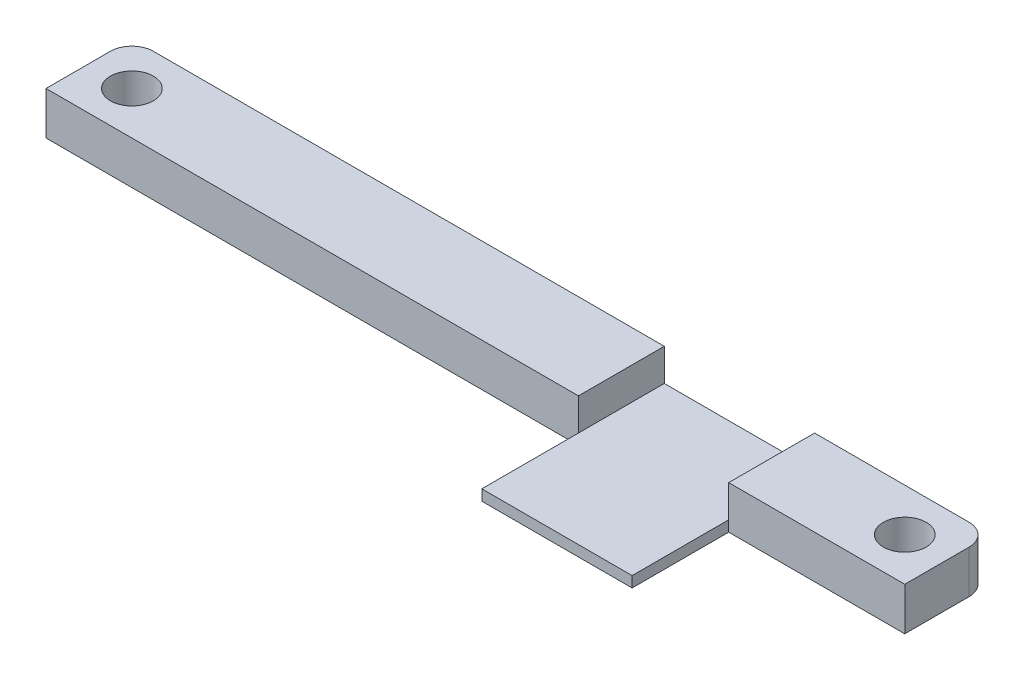
ISO-10303-21;
HEADER;
FILE_DESCRIPTION(('STEP AP214'),'2;1');
FILE_NAME('part.step','',(''),(''),'','','');
FILE_SCHEMA(('AUTOMOTIVE_DESIGN { 1 0 10303 214 1 1 1 1 }'));
ENDSEC;
DATA;
#1=APPLICATION_CONTEXT('core data for automotive mechanical design processes');
#2=APPLICATION_PROTOCOL_DEFINITION('international standard','automotive_design',2000,#1);
#3=PRODUCT_CONTEXT('',#1,'mechanical');
#4=PRODUCT('Part','Part','',(#3));
#5=PRODUCT_RELATED_PRODUCT_CATEGORY('part','',(#4));
#6=PRODUCT_DEFINITION_FORMATION('','',#4);
#7=PRODUCT_DEFINITION_CONTEXT('part definition',#1,'design');
#8=PRODUCT_DEFINITION('design','',#6,#7);
#9=PRODUCT_DEFINITION_SHAPE('','',#8);
#10=(LENGTH_UNIT() NAMED_UNIT(*) SI_UNIT(.MILLI.,.METRE.));
#11=(NAMED_UNIT(*) PLANE_ANGLE_UNIT() SI_UNIT($,.RADIAN.));
#12=(NAMED_UNIT(*) SI_UNIT($,.STERADIAN.) SOLID_ANGLE_UNIT());
#13=UNCERTAINTY_MEASURE_WITH_UNIT(LENGTH_MEASURE(1.E-05),#10,'distance_accuracy_value','');
#14=(GEOMETRIC_REPRESENTATION_CONTEXT(3) GLOBAL_UNCERTAINTY_ASSIGNED_CONTEXT((#13)) GLOBAL_UNIT_ASSIGNED_CONTEXT((#10,
#11,#12)) REPRESENTATION_CONTEXT('',''));
#15=CARTESIAN_POINT('',(0.,0.,0.));
#16=DIRECTION('',(0.,0.,1.));
#17=DIRECTION('',(1.,0.,0.));
#18=AXIS2_PLACEMENT_3D('',#15,#16,#17);
#19=CARTESIAN_POINT('',(0.,-8.,2.));
#20=DIRECTION('',(0.,0.,1.));
#21=DIRECTION('',(1.,0.,0.));
#22=AXIS2_PLACEMENT_3D('',#19,#20,#21);
#23=PLANE('',#22);
#24=DIRECTION('',(-1.,0.,0.));
#25=VECTOR('',#24,1.);
#26=CARTESIAN_POINT('',(0.,8.,2.00000000000001));
#27=LINE('',#26,#25);
#28=CARTESIAN_POINT('',(9.60000000000001,8.,2.));
#29=VERTEX_POINT('',#28);
#30=CARTESIAN_POINT('',(-40.,8.,2.));
#31=VERTEX_POINT('',#30);
#32=EDGE_CURVE('E324',#29,#31,#27,.T.);
#33=ORIENTED_EDGE('',*,*,#32,.F.);
#34=DIRECTION('',(0.,1.,0.));
#35=VECTOR('',#34,1.);
#36=CARTESIAN_POINT('',(9.60000000000001,8.,2.));
#37=LINE('',#36,#35);
#38=CARTESIAN_POINT('',(9.60000000000001,9.,2.));
#39=VERTEX_POINT('',#38);
#40=EDGE_CURVE('E228',#29,#39,#37,.T.);
#41=ORIENTED_EDGE('',*,*,#40,.T.);
#42=DIRECTION('',(0.,1.,0.));
#43=VECTOR('',#42,1.);
#44=CARTESIAN_POINT('',(9.60000000000001,10.,2.));
#45=LINE('',#44,#43);
#46=CARTESIAN_POINT('',(9.60000000000001,12.,2.));
#47=VERTEX_POINT('',#46);
#48=EDGE_CURVE('E245',#39,#47,#45,.T.);
#49=ORIENTED_EDGE('',*,*,#48,.T.);
#50=DIRECTION('',(1.,0.,0.));
#51=VECTOR('',#50,1.);
#52=CARTESIAN_POINT('',(0.,12.,2.));
#53=LINE('',#52,#51);
#54=CARTESIAN_POINT('',(-40.,12.,2.));
#55=VERTEX_POINT('',#54);
#56=EDGE_CURVE('E319',#55,#47,#53,.T.);
#57=ORIENTED_EDGE('',*,*,#56,.F.);
#58=DIRECTION('',(0.,1.,0.));
#59=VECTOR('',#58,1.);
#60=CARTESIAN_POINT('',(-40.,8.,2.));
#61=LINE('',#60,#59);
#62=EDGE_CURVE('E310',#31,#55,#61,.T.);
#63=ORIENTED_EDGE('',*,*,#62,.F.);
#64=EDGE_LOOP('',(#33,#41,#49,#57,#63));
#65=FACE_BOUND('',#64,.T.);
#66=ADVANCED_FACE('F76',(#65),#23,.T.);
#67=CARTESIAN_POINT('',(0.,12.,0.));
#68=DIRECTION('',(0.,1.,0.));
#69=DIRECTION('',(0.,0.,1.));
#70=AXIS2_PLACEMENT_3D('',#67,#68,#69);
#71=PLANE('',#70);
#72=CARTESIAN_POINT('',(-36.,12.,-2.));
#73=DIRECTION('',(0.,1.,0.));
#74=DIRECTION('',(0.,0.,1.));
#75=AXIS2_PLACEMENT_3D('',#72,#73,#74);
#76=CIRCLE('',#75,2.);
#77=CARTESIAN_POINT('',(-36.,12.,0.));
#78=VERTEX_POINT('',#77);
#79=EDGE_CURVE('E282',#78,#78,#76,.T.);
#80=ORIENTED_EDGE('',*,*,#79,.F.);
#81=EDGE_LOOP('',(#80));
#82=FACE_BOUND('',#81,.T.);
#83=ORIENTED_EDGE('',*,*,#56,.T.);
#84=DIRECTION('',(0.,0.,-1.));
#85=VECTOR('',#84,1.);
#86=CARTESIAN_POINT('',(9.60000000000001,12.,2.));
#87=LINE('',#86,#85);
#88=CARTESIAN_POINT('',(9.60000000000001,12.,-6.00000000000003));
#89=VERTEX_POINT('',#88);
#90=EDGE_CURVE('E240',#47,#89,#87,.T.);
#91=ORIENTED_EDGE('',*,*,#90,.T.);
#92=DIRECTION('',(-1.,0.,0.));
#93=VECTOR('',#92,1.);
#94=CARTESIAN_POINT('',(-36.,12.,-6.));
#95=LINE('',#94,#93);
#96=CARTESIAN_POINT('',(-38.,12.,-6.));
#97=VERTEX_POINT('',#96);
#98=EDGE_CURVE('E119',#89,#97,#95,.T.);
#99=ORIENTED_EDGE('',*,*,#98,.T.);
#100=CARTESIAN_POINT('',(-38.,12.,-4.));
#101=DIRECTION('',(0.,1.,0.));
#102=DIRECTION('',(0.,0.,1.));
#103=AXIS2_PLACEMENT_3D('',#100,#101,#102);
#104=CIRCLE('',#103,2.);
#105=CARTESIAN_POINT('',(-40.,12.,-4.));
#106=VERTEX_POINT('',#105);
#107=EDGE_CURVE('E300',#106,#97,#104,.F.);
#108=ORIENTED_EDGE('',*,*,#107,.F.);
#109=DIRECTION('',(0.,0.,-1.));
#110=VECTOR('',#109,1.);
#111=CARTESIAN_POINT('',(-40.,12.,0.));
#112=LINE('',#111,#110);
#113=EDGE_CURVE('E291',#55,#106,#112,.T.);
#114=ORIENTED_EDGE('',*,*,#113,.F.);
#115=EDGE_LOOP('',(#83,#91,#99,#108,#114));
#116=FACE_BOUND('',#115,.T.);
#117=ADVANCED_FACE('F377',(#82,#116),#71,.T.);
#118=DIRECTION('',(0.,0.,-1.));
#119=VECTOR('',#118,1.);
#120=CARTESIAN_POINT('',(23.6,12.,2.));
#121=LINE('',#120,#119);
#122=CARTESIAN_POINT('',(23.6,12.,2.));
#123=VERTEX_POINT('',#122);
#124=CARTESIAN_POINT('',(23.6,12.,-6.00000000000003));
#125=VERTEX_POINT('',#124);
#126=EDGE_CURVE('E187',#123,#125,#121,.T.);
#127=ORIENTED_EDGE('',*,*,#126,.F.);
#128=CARTESIAN_POINT('',(40.,12.,2.));
#129=VERTEX_POINT('',#128);
#130=EDGE_CURVE('E309',#123,#129,#53,.T.);
#131=ORIENTED_EDGE('',*,*,#130,.T.);
#132=DIRECTION('',(0.,0.,1.));
#133=VECTOR('',#132,1.);
#134=CARTESIAN_POINT('',(40.,12.,-4.));
#135=LINE('',#134,#133);
#136=CARTESIAN_POINT('',(40.,12.,-4.));
#137=VERTEX_POINT('',#136);
#138=EDGE_CURVE('E262',#137,#129,#135,.T.);
#139=ORIENTED_EDGE('',*,*,#138,.F.);
#140=CARTESIAN_POINT('',(38.,12.,-4.));
#141=DIRECTION('',(0.,1.,0.));
#142=DIRECTION('',(0.,0.,1.));
#143=AXIS2_PLACEMENT_3D('',#140,#141,#142);
#144=CIRCLE('',#143,2.);
#145=CARTESIAN_POINT('',(38.,12.,-6.));
#146=VERTEX_POINT('',#145);
#147=EDGE_CURVE('E266',#137,#146,#144,.T.);
#148=ORIENTED_EDGE('',*,*,#147,.T.);
#149=EDGE_CURVE('E85',#146,#125,#95,.T.);
#150=ORIENTED_EDGE('',*,*,#149,.T.);
#151=EDGE_LOOP('',(#127,#131,#139,#148,#150));
#152=FACE_BOUND('',#151,.T.);
#153=CARTESIAN_POINT('',(36.,12.,-2.));
#154=DIRECTION('',(0.,1.,0.));
#155=DIRECTION('',(0.,0.,1.));
#156=AXIS2_PLACEMENT_3D('',#153,#154,#155);
#157=CIRCLE('',#156,2.);
#158=CARTESIAN_POINT('',(36.,12.,0.));
#159=VERTEX_POINT('',#158);
#160=EDGE_CURVE('E278',#159,#159,#157,.T.);
#161=ORIENTED_EDGE('',*,*,#160,.F.);
#162=EDGE_LOOP('',(#161));
#163=FACE_BOUND('',#162,.T.);
#164=ADVANCED_FACE('F358',(#152,#163),#71,.T.);
#165=CARTESIAN_POINT('',(0.,8.,-6.));
#166=DIRECTION('',(0.,-1.,0.));
#167=DIRECTION('',(0.,0.,-1.));
#168=AXIS2_PLACEMENT_3D('',#165,#166,#167);
#169=PLANE('',#168);
#170=DIRECTION('',(1.,0.,0.));
#171=VECTOR('',#170,1.);
#172=CARTESIAN_POINT('',(0.,8.,-6.));
#173=LINE('',#172,#171);
#174=CARTESIAN_POINT('',(-38.,8.,-6.));
#175=VERTEX_POINT('',#174);
#176=CARTESIAN_POINT('',(38.,8.,-6.));
#177=VERTEX_POINT('',#176);
#178=EDGE_CURVE('E100',#175,#177,#173,.T.);
#179=ORIENTED_EDGE('',*,*,#178,.T.);
#180=CARTESIAN_POINT('',(38.,8.,-4.));
#181=DIRECTION('',(0.,1.,0.));
#182=DIRECTION('',(0.,0.,1.));
#183=AXIS2_PLACEMENT_3D('',#180,#181,#182);
#184=CIRCLE('',#183,2.);
#185=CARTESIAN_POINT('',(40.,8.,-4.));
#186=VERTEX_POINT('',#185);
#187=EDGE_CURVE('E267',#186,#177,#184,.T.);
#188=ORIENTED_EDGE('',*,*,#187,.F.);
#189=DIRECTION('',(0.,0.,1.));
#190=VECTOR('',#189,1.);
#191=CARTESIAN_POINT('',(40.,8.,-4.));
#192=LINE('',#191,#190);
#193=CARTESIAN_POINT('',(40.,8.,2.));
#194=VERTEX_POINT('',#193);
#195=EDGE_CURVE('E261',#186,#194,#192,.T.);
#196=ORIENTED_EDGE('',*,*,#195,.T.);
#197=CARTESIAN_POINT('',(23.6,8.,2.));
#198=VERTEX_POINT('',#197);
#199=EDGE_CURVE('E320',#194,#198,#27,.T.);
#200=ORIENTED_EDGE('',*,*,#199,.T.);
#201=DIRECTION('',(0.,0.,1.));
#202=VECTOR('',#201,1.);
#203=CARTESIAN_POINT('',(23.6,8.,2.));
#204=LINE('',#203,#202);
#205=CARTESIAN_POINT('',(23.6,8.,11.));
#206=VERTEX_POINT('',#205);
#207=EDGE_CURVE('E216',#198,#206,#204,.T.);
#208=ORIENTED_EDGE('',*,*,#207,.T.);
#209=DIRECTION('',(1.,0.,0.));
#210=VECTOR('',#209,1.);
#211=CARTESIAN_POINT('',(9.60000000000001,8.,11.));
#212=LINE('',#211,#210);
#213=CARTESIAN_POINT('',(9.60000000000001,8.,11.));
#214=VERTEX_POINT('',#213);
#215=EDGE_CURVE('E212',#214,#206,#212,.T.);
#216=ORIENTED_EDGE('',*,*,#215,.F.);
#217=DIRECTION('',(0.,0.,1.));
#218=VECTOR('',#217,1.);
#219=CARTESIAN_POINT('',(9.60000000000001,8.,2.));
#220=LINE('',#219,#218);
#221=EDGE_CURVE('E219',#29,#214,#220,.T.);
#222=ORIENTED_EDGE('',*,*,#221,.F.);
#223=ORIENTED_EDGE('',*,*,#32,.T.);
#224=DIRECTION('',(0.,0.,-1.));
#225=VECTOR('',#224,1.);
#226=CARTESIAN_POINT('',(-40.,8.,0.));
#227=LINE('',#226,#225);
#228=CARTESIAN_POINT('',(-40.,8.,-4.));
#229=VERTEX_POINT('',#228);
#230=EDGE_CURVE('E123',#31,#229,#227,.T.);
#231=ORIENTED_EDGE('',*,*,#230,.T.);
#232=CARTESIAN_POINT('',(-38.,8.,-4.));
#233=DIRECTION('',(0.,1.,0.));
#234=DIRECTION('',(0.,0.,1.));
#235=AXIS2_PLACEMENT_3D('',#232,#233,#234);
#236=CIRCLE('',#235,2.);
#237=EDGE_CURVE('E290',#229,#175,#236,.F.);
#238=ORIENTED_EDGE('',*,*,#237,.T.);
#239=EDGE_LOOP('',(#179,#188,#196,#200,#208,#216,#222,#223,#231,#238));
#240=FACE_BOUND('',#239,.T.);
#241=CARTESIAN_POINT('',(-36.,8.,-2.));
#242=DIRECTION('',(0.,1.,0.));
#243=DIRECTION('',(0.,0.,1.));
#244=AXIS2_PLACEMENT_3D('',#241,#242,#243);
#245=CIRCLE('',#244,2.);
#246=CARTESIAN_POINT('',(-36.,8.,0.));
#247=VERTEX_POINT('',#246);
#248=EDGE_CURVE('E286',#247,#247,#245,.T.);
#249=ORIENTED_EDGE('',*,*,#248,.T.);
#250=EDGE_LOOP('',(#249));
#251=FACE_BOUND('',#250,.T.);
#252=CARTESIAN_POINT('',(36.,8.,-2.));
#253=DIRECTION('',(0.,1.,0.));
#254=DIRECTION('',(0.,0.,1.));
#255=AXIS2_PLACEMENT_3D('',#252,#253,#254);
#256=CIRCLE('',#255,2.);
#257=CARTESIAN_POINT('',(36.,8.,0.));
#258=VERTEX_POINT('',#257);
#259=EDGE_CURVE('E271',#258,#258,#256,.T.);
#260=ORIENTED_EDGE('',*,*,#259,.T.);
#261=EDGE_LOOP('',(#260));
#262=FACE_BOUND('',#261,.T.);
#263=ADVANCED_FACE('F340',(#240,#251,#262),#169,.T.);
#264=CARTESIAN_POINT('',(-36.,12.,-6.));
#265=DIRECTION('',(0.,0.,-1.));
#266=DIRECTION('',(-1.,0.,0.));
#267=AXIS2_PLACEMENT_3D('',#264,#265,#266);
#268=PLANE('',#267);
#269=DIRECTION('',(-1.,0.,0.));
#270=VECTOR('',#269,1.);
#271=CARTESIAN_POINT('',(23.6,9.,-6.));
#272=LINE('',#271,#270);
#273=CARTESIAN_POINT('',(23.6,9.,-6.));
#274=VERTEX_POINT('',#273);
#275=CARTESIAN_POINT('',(9.60000000000001,9.,-6.));
#276=VERTEX_POINT('',#275);
#277=EDGE_CURVE('E197',#274,#276,#272,.T.);
#278=ORIENTED_EDGE('',*,*,#277,.F.);
#279=DIRECTION('',(0.,1.,0.));
#280=VECTOR('',#279,1.);
#281=CARTESIAN_POINT('',(23.6,10.,-6.00000000000003));
#282=LINE('',#281,#280);
#283=EDGE_CURVE('E182',#274,#125,#282,.T.);
#284=ORIENTED_EDGE('',*,*,#283,.T.);
#285=ORIENTED_EDGE('',*,*,#149,.F.);
#286=DIRECTION('',(0.,1.,0.));
#287=VECTOR('',#286,1.);
#288=CARTESIAN_POINT('',(38.,8.,-6.));
#289=LINE('',#288,#287);
#290=EDGE_CURVE('E191',#177,#146,#289,.T.);
#291=ORIENTED_EDGE('',*,*,#290,.F.);
#292=ORIENTED_EDGE('',*,*,#178,.F.);
#293=DIRECTION('',(0.,1.,0.));
#294=VECTOR('',#293,1.);
#295=CARTESIAN_POINT('',(-38.,8.,-6.));
#296=LINE('',#295,#294);
#297=EDGE_CURVE('E306',#175,#97,#296,.T.);
#298=ORIENTED_EDGE('',*,*,#297,.T.);
#299=ORIENTED_EDGE('',*,*,#98,.F.);
#300=DIRECTION('',(0.,1.,0.));
#301=VECTOR('',#300,1.);
#302=CARTESIAN_POINT('',(9.60000000000001,10.,-6.00000000000003));
#303=LINE('',#302,#301);
#304=EDGE_CURVE('E202',#276,#89,#303,.T.);
#305=ORIENTED_EDGE('',*,*,#304,.F.);
#306=EDGE_LOOP('',(#278,#284,#285,#291,#292,#298,#299,#305));
#307=FACE_BOUND('',#306,.T.);
#308=ADVANCED_FACE('F78',(#307),#268,.T.);
#309=DIRECTION('',(0.,1.,0.));
#310=VECTOR('',#309,1.);
#311=CARTESIAN_POINT('',(23.6,8.,2.));
#312=LINE('',#311,#310);
#313=CARTESIAN_POINT('',(23.6,9.,2.));
#314=VERTEX_POINT('',#313);
#315=EDGE_CURVE('E232',#198,#314,#312,.T.);
#316=ORIENTED_EDGE('',*,*,#315,.F.);
#317=ORIENTED_EDGE('',*,*,#199,.F.);
#318=DIRECTION('',(0.,1.,0.));
#319=VECTOR('',#318,1.);
#320=CARTESIAN_POINT('',(40.,8.,2.));
#321=LINE('',#320,#319);
#322=EDGE_CURVE('E257',#194,#129,#321,.T.);
#323=ORIENTED_EDGE('',*,*,#322,.T.);
#324=ORIENTED_EDGE('',*,*,#130,.F.);
#325=DIRECTION('',(0.,1.,0.));
#326=VECTOR('',#325,1.);
#327=CARTESIAN_POINT('',(23.6,10.,2.));
#328=LINE('',#327,#326);
#329=EDGE_CURVE('E192',#314,#123,#328,.T.);
#330=ORIENTED_EDGE('',*,*,#329,.F.);
#331=EDGE_LOOP('',(#316,#317,#323,#324,#330));
#332=FACE_BOUND('',#331,.T.);
#333=ADVANCED_FACE('F350',(#332),#23,.T.);
#334=CARTESIAN_POINT('',(-38.,8.,-4.));
#335=DIRECTION('',(0.,1.,0.));
#336=DIRECTION('',(0.,0.,1.));
#337=AXIS2_PLACEMENT_3D('',#334,#335,#336);
#338=CYLINDRICAL_SURFACE('',#337,2.);
#339=ORIENTED_EDGE('',*,*,#107,.T.);
#340=ORIENTED_EDGE('',*,*,#297,.F.);
#341=ORIENTED_EDGE('',*,*,#237,.F.);
#342=DIRECTION('',(0.,1.,0.));
#343=VECTOR('',#342,1.);
#344=CARTESIAN_POINT('',(-40.,8.,-4.));
#345=LINE('',#344,#343);
#346=EDGE_CURVE('E296',#229,#106,#345,.T.);
#347=ORIENTED_EDGE('',*,*,#346,.T.);
#348=EDGE_LOOP('',(#339,#340,#341,#347));
#349=FACE_BOUND('',#348,.T.);
#350=ADVANCED_FACE('F386',(#349),#338,.T.);
#351=CARTESIAN_POINT('',(-36.,8.,-2.));
#352=DIRECTION('',(0.,1.,0.));
#353=DIRECTION('',(0.,0.,1.));
#354=AXIS2_PLACEMENT_3D('',#351,#352,#353);
#355=CYLINDRICAL_SURFACE('',#354,2.);
#356=ORIENTED_EDGE('',*,*,#248,.F.);
#357=EDGE_LOOP('',(#356));
#358=FACE_BOUND('',#357,.T.);
#359=ORIENTED_EDGE('',*,*,#79,.T.);
#360=EDGE_LOOP('',(#359));
#361=FACE_BOUND('',#360,.T.);
#362=ADVANCED_FACE('F372',(#358,#361),#355,.F.);
#363=CARTESIAN_POINT('',(-40.,8.,0.));
#364=DIRECTION('',(1.,0.,0.));
#365=DIRECTION('',(0.,0.,-1.));
#366=AXIS2_PLACEMENT_3D('',#363,#364,#365);
#367=PLANE('',#366);
#368=ORIENTED_EDGE('',*,*,#113,.T.);
#369=ORIENTED_EDGE('',*,*,#346,.F.);
#370=ORIENTED_EDGE('',*,*,#230,.F.);
#371=ORIENTED_EDGE('',*,*,#62,.T.);
#372=EDGE_LOOP('',(#368,#369,#370,#371));
#373=FACE_BOUND('',#372,.T.);
#374=ADVANCED_FACE('F364',(#373),#367,.F.);
#375=CARTESIAN_POINT('',(38.,8.,-4.));
#376=DIRECTION('',(0.,1.,0.));
#377=DIRECTION('',(0.,0.,1.));
#378=AXIS2_PLACEMENT_3D('',#375,#376,#377);
#379=CYLINDRICAL_SURFACE('',#378,2.);
#380=ORIENTED_EDGE('',*,*,#147,.F.);
#381=DIRECTION('',(0.,1.,0.));
#382=VECTOR('',#381,1.);
#383=CARTESIAN_POINT('',(40.,8.,-4.));
#384=LINE('',#383,#382);
#385=EDGE_CURVE('E254',#186,#137,#384,.T.);
#386=ORIENTED_EDGE('',*,*,#385,.F.);
#387=ORIENTED_EDGE('',*,*,#187,.T.);
#388=ORIENTED_EDGE('',*,*,#290,.T.);
#389=EDGE_LOOP('',(#380,#386,#387,#388));
#390=FACE_BOUND('',#389,.T.);
#391=ADVANCED_FACE('F362',(#390),#379,.T.);
#392=CARTESIAN_POINT('',(40.,8.,-4.));
#393=DIRECTION('',(-1.,0.,0.));
#394=DIRECTION('',(0.,0.,1.));
#395=AXIS2_PLACEMENT_3D('',#392,#393,#394);
#396=PLANE('',#395);
#397=ORIENTED_EDGE('',*,*,#138,.T.);
#398=ORIENTED_EDGE('',*,*,#322,.F.);
#399=ORIENTED_EDGE('',*,*,#195,.F.);
#400=ORIENTED_EDGE('',*,*,#385,.T.);
#401=EDGE_LOOP('',(#397,#398,#399,#400));
#402=FACE_BOUND('',#401,.T.);
#403=ADVANCED_FACE('F356',(#402),#396,.F.);
#404=CARTESIAN_POINT('',(36.,8.,-2.));
#405=DIRECTION('',(0.,1.,0.));
#406=DIRECTION('',(0.,0.,1.));
#407=AXIS2_PLACEMENT_3D('',#404,#405,#406);
#408=CYLINDRICAL_SURFACE('',#407,2.);
#409=ORIENTED_EDGE('',*,*,#259,.F.);
#410=EDGE_LOOP('',(#409));
#411=FACE_BOUND('',#410,.T.);
#412=ORIENTED_EDGE('',*,*,#160,.T.);
#413=EDGE_LOOP('',(#412));
#414=FACE_BOUND('',#413,.T.);
#415=ADVANCED_FACE('F370',(#411,#414),#408,.F.);
#416=CARTESIAN_POINT('',(23.6,10.,2.));
#417=DIRECTION('',(1.,0.,0.));
#418=DIRECTION('',(0.,0.,-1.));
#419=AXIS2_PLACEMENT_3D('',#416,#417,#418);
#420=PLANE('',#419);
#421=ORIENTED_EDGE('',*,*,#126,.T.);
#422=ORIENTED_EDGE('',*,*,#283,.F.);
#423=DIRECTION('',(0.,0.,-1.));
#424=VECTOR('',#423,1.);
#425=CARTESIAN_POINT('',(23.6,9.,14.));
#426=LINE('',#425,#424);
#427=EDGE_CURVE('E185',#314,#274,#426,.T.);
#428=ORIENTED_EDGE('',*,*,#427,.F.);
#429=ORIENTED_EDGE('',*,*,#329,.T.);
#430=EDGE_LOOP('',(#421,#422,#428,#429));
#431=FACE_BOUND('',#430,.T.);
#432=ADVANCED_FACE('F184',(#431),#420,.F.);
#433=CARTESIAN_POINT('',(9.60000000000001,10.,2.));
#434=DIRECTION('',(1.,0.,0.));
#435=DIRECTION('',(0.,0.,-1.));
#436=AXIS2_PLACEMENT_3D('',#433,#434,#435);
#437=PLANE('',#436);
#438=ORIENTED_EDGE('',*,*,#90,.F.);
#439=ORIENTED_EDGE('',*,*,#48,.F.);
#440=DIRECTION('',(0.,0.,-1.));
#441=VECTOR('',#440,1.);
#442=CARTESIAN_POINT('',(9.60000000000001,9.,14.));
#443=LINE('',#442,#441);
#444=EDGE_CURVE('E200',#39,#276,#443,.T.);
#445=ORIENTED_EDGE('',*,*,#444,.T.);
#446=ORIENTED_EDGE('',*,*,#304,.T.);
#447=EDGE_LOOP('',(#438,#439,#445,#446));
#448=FACE_BOUND('',#447,.T.);
#449=ADVANCED_FACE('F466',(#448),#437,.T.);
#450=CARTESIAN_POINT('',(9.60000000000001,8.,11.));
#451=DIRECTION('',(0.,0.,1.));
#452=DIRECTION('',(1.,0.,0.));
#453=AXIS2_PLACEMENT_3D('',#450,#451,#452);
#454=PLANE('',#453);
#455=DIRECTION('',(1.,0.,0.));
#456=VECTOR('',#455,1.);
#457=CARTESIAN_POINT('',(9.60000000000001,9.,11.));
#458=LINE('',#457,#456);
#459=CARTESIAN_POINT('',(9.60000000000001,9.,11.));
#460=VERTEX_POINT('',#459);
#461=CARTESIAN_POINT('',(23.6,9.,11.));
#462=VERTEX_POINT('',#461);
#463=EDGE_CURVE('E92',#460,#462,#458,.T.);
#464=ORIENTED_EDGE('',*,*,#463,.F.);
#465=DIRECTION('',(0.,1.,0.));
#466=VECTOR('',#465,1.);
#467=CARTESIAN_POINT('',(9.60000000000001,8.,11.));
#468=LINE('',#467,#466);
#469=EDGE_CURVE('E224',#214,#460,#468,.T.);
#470=ORIENTED_EDGE('',*,*,#469,.F.);
#471=ORIENTED_EDGE('',*,*,#215,.T.);
#472=DIRECTION('',(0.,1.,0.));
#473=VECTOR('',#472,1.);
#474=CARTESIAN_POINT('',(23.6,8.,11.));
#475=LINE('',#474,#473);
#476=EDGE_CURVE('E223',#206,#462,#475,.T.);
#477=ORIENTED_EDGE('',*,*,#476,.T.);
#478=EDGE_LOOP('',(#464,#470,#471,#477));
#479=FACE_BOUND('',#478,.T.);
#480=ADVANCED_FACE('F345',(#479),#454,.T.);
#481=CARTESIAN_POINT('',(9.60000000000001,8.,2.));
#482=DIRECTION('',(-1.,0.,0.));
#483=DIRECTION('',(0.,0.,1.));
#484=AXIS2_PLACEMENT_3D('',#481,#482,#483);
#485=PLANE('',#484);
#486=EDGE_CURVE('E208',#460,#39,#443,.T.);
#487=ORIENTED_EDGE('',*,*,#486,.T.);
#488=ORIENTED_EDGE('',*,*,#40,.F.);
#489=ORIENTED_EDGE('',*,*,#221,.T.);
#490=ORIENTED_EDGE('',*,*,#469,.T.);
#491=EDGE_LOOP('',(#487,#488,#489,#490));
#492=FACE_BOUND('',#491,.T.);
#493=ADVANCED_FACE('F335',(#492),#485,.T.);
#494=CARTESIAN_POINT('',(23.6,8.,2.));
#495=DIRECTION('',(-1.,0.,0.));
#496=DIRECTION('',(0.,0.,1.));
#497=AXIS2_PLACEMENT_3D('',#494,#495,#496);
#498=PLANE('',#497);
#499=ORIENTED_EDGE('',*,*,#315,.T.);
#500=DIRECTION('',(0.,0.,1.));
#501=VECTOR('',#500,1.);
#502=CARTESIAN_POINT('',(23.6,9.,2.));
#503=LINE('',#502,#501);
#504=EDGE_CURVE('E12',#314,#462,#503,.T.);
#505=ORIENTED_EDGE('',*,*,#504,.T.);
#506=ORIENTED_EDGE('',*,*,#476,.F.);
#507=ORIENTED_EDGE('',*,*,#207,.F.);
#508=EDGE_LOOP('',(#499,#505,#506,#507));
#509=FACE_BOUND('',#508,.T.);
#510=ADVANCED_FACE('F347',(#509),#498,.F.);
#511=CARTESIAN_POINT('',(23.6,9.,14.));
#512=DIRECTION('',(0.,-1.,0.));
#513=DIRECTION('',(0.,0.,-1.));
#514=AXIS2_PLACEMENT_3D('',#511,#512,#513);
#515=PLANE('',#514);
#516=ORIENTED_EDGE('',*,*,#463,.T.);
#517=ORIENTED_EDGE('',*,*,#504,.F.);
#518=ORIENTED_EDGE('',*,*,#427,.T.);
#519=ORIENTED_EDGE('',*,*,#277,.T.);
#520=ORIENTED_EDGE('',*,*,#444,.F.);
#521=ORIENTED_EDGE('',*,*,#486,.F.);
#522=EDGE_LOOP('',(#516,#517,#518,#519,#520,#521));
#523=FACE_BOUND('',#522,.T.);
#524=ADVANCED_FACE('F195',(#523),#515,.F.);
#525=CLOSED_SHELL('',(#66,#117,#164,#263,#308,#333,#350,#362,#374,#391,#403,#415,#432,#449,#480,
#493,#510,#524));
#526=MANIFOLD_SOLID_BREP('B2',#525);
#527=ADVANCED_BREP_SHAPE_REPRESENTATION('',(#18,#526),#14);
#528=SHAPE_DEFINITION_REPRESENTATION(#9,#527);
ENDSEC;
END-ISO-10303-21;
